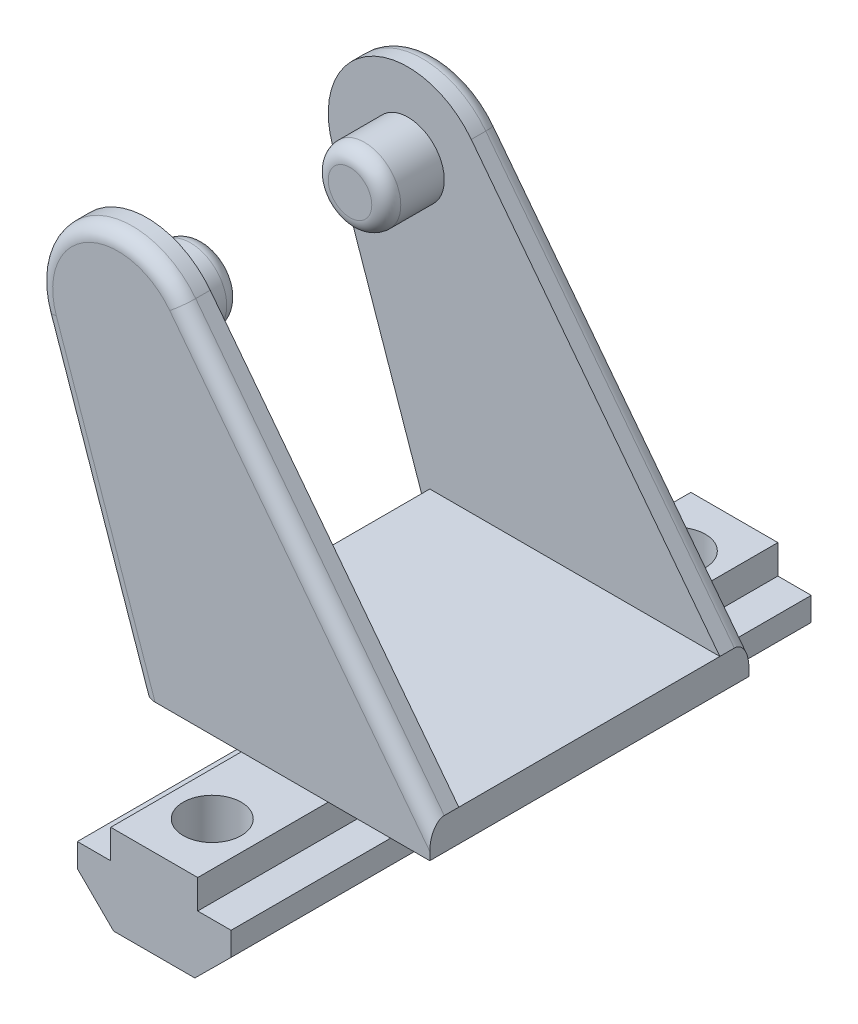
ISO-10303-21;
HEADER;
FILE_DESCRIPTION(('STEP AP214'),'2;1');
FILE_NAME('part.step','',(''),(''),'','','');
FILE_SCHEMA(('AUTOMOTIVE_DESIGN { 1 0 10303 214 1 1 1 1 }'));
ENDSEC;
DATA;
#1=APPLICATION_CONTEXT('core data for automotive mechanical design processes');
#2=APPLICATION_PROTOCOL_DEFINITION('international standard','automotive_design',2000,#1);
#3=PRODUCT_CONTEXT('',#1,'mechanical');
#4=PRODUCT('Part','Part','',(#3));
#5=PRODUCT_RELATED_PRODUCT_CATEGORY('part','',(#4));
#6=PRODUCT_DEFINITION_FORMATION('','',#4);
#7=PRODUCT_DEFINITION_CONTEXT('part definition',#1,'design');
#8=PRODUCT_DEFINITION('design','',#6,#7);
#9=PRODUCT_DEFINITION_SHAPE('','',#8);
#10=(LENGTH_UNIT() NAMED_UNIT(*) SI_UNIT(.MILLI.,.METRE.));
#11=(NAMED_UNIT(*) PLANE_ANGLE_UNIT() SI_UNIT($,.RADIAN.));
#12=(NAMED_UNIT(*) SI_UNIT($,.STERADIAN.) SOLID_ANGLE_UNIT());
#13=UNCERTAINTY_MEASURE_WITH_UNIT(LENGTH_MEASURE(1.E-05),#10,'distance_accuracy_value','');
#14=(GEOMETRIC_REPRESENTATION_CONTEXT(3) GLOBAL_UNCERTAINTY_ASSIGNED_CONTEXT((#13)) GLOBAL_UNIT_ASSIGNED_CONTEXT((#10,
#11,#12)) REPRESENTATION_CONTEXT('',''));
#15=CARTESIAN_POINT('',(0.,0.,0.));
#16=DIRECTION('',(0.,0.,1.));
#17=DIRECTION('',(1.,0.,0.));
#18=AXIS2_PLACEMENT_3D('',#15,#16,#17);
#19=CARTESIAN_POINT('',(-10.,2.2,11.));
#20=DIRECTION('',(1.,0.,0.));
#21=DIRECTION('',(0.,0.,-1.));
#22=AXIS2_PLACEMENT_3D('',#19,#20,#21);
#23=PLANE('',#22);
#24=DIRECTION('',(0.,1.,0.));
#25=VECTOR('',#24,1.);
#26=CARTESIAN_POINT('',(-10.,2.2,-9.));
#27=LINE('',#26,#25);
#28=CARTESIAN_POINT('',(-10.,0.,-9.));
#29=VERTEX_POINT('',#28);
#30=CARTESIAN_POINT('',(-10.,2.2,-9.));
#31=VERTEX_POINT('',#30);
#32=EDGE_CURVE('E253',#29,#31,#27,.T.);
#33=ORIENTED_EDGE('',*,*,#32,.F.);
#34=DIRECTION('',(0.,0.,1.));
#35=VECTOR('',#34,1.);
#36=CARTESIAN_POINT('',(-10.,0.,11.));
#37=LINE('',#36,#35);
#38=CARTESIAN_POINT('',(-10.,0.,9.));
#39=VERTEX_POINT('',#38);
#40=EDGE_CURVE('E290',#29,#39,#37,.T.);
#41=ORIENTED_EDGE('',*,*,#40,.T.);
#42=DIRECTION('',(0.,-1.,0.));
#43=VECTOR('',#42,1.);
#44=CARTESIAN_POINT('',(-10.,2.2,9.));
#45=LINE('',#44,#43);
#46=CARTESIAN_POINT('',(-10.,2.2,9.));
#47=VERTEX_POINT('',#46);
#48=EDGE_CURVE('E286',#47,#39,#45,.T.);
#49=ORIENTED_EDGE('',*,*,#48,.F.);
#50=DIRECTION('',(0.,0.,1.));
#51=VECTOR('',#50,1.);
#52=CARTESIAN_POINT('',(-10.,2.2,11.));
#53=LINE('',#52,#51);
#54=EDGE_CURVE('E291',#31,#47,#53,.T.);
#55=ORIENTED_EDGE('',*,*,#54,.F.);
#56=EDGE_LOOP('',(#33,#41,#49,#55));
#57=FACE_BOUND('',#56,.T.);
#58=ADVANCED_FACE('F39',(#57),#23,.F.);
#59=CARTESIAN_POINT('',(0.,2.2,0.));
#60=DIRECTION('',(0.,-1.,0.));
#61=DIRECTION('',(0.,0.,-1.));
#62=AXIS2_PLACEMENT_3D('',#59,#60,#61);
#63=PLANE('',#62);
#64=DIRECTION('',(1.,0.,0.));
#65=VECTOR('',#64,1.);
#66=CARTESIAN_POINT('',(0.,2.2,-9.));
#67=LINE('',#66,#65);
#68=CARTESIAN_POINT('',(10.,2.2,-9.));
#69=VERTEX_POINT('',#68);
#70=EDGE_CURVE('E248',#31,#69,#67,.T.);
#71=ORIENTED_EDGE('',*,*,#70,.F.);
#72=ORIENTED_EDGE('',*,*,#54,.T.);
#73=DIRECTION('',(-1.,0.,0.));
#74=VECTOR('',#73,1.);
#75=CARTESIAN_POINT('',(0.,2.2,9.));
#76=LINE('',#75,#74);
#77=CARTESIAN_POINT('',(10.,2.2,9.));
#78=VERTEX_POINT('',#77);
#79=EDGE_CURVE('E275',#78,#47,#76,.T.);
#80=ORIENTED_EDGE('',*,*,#79,.F.);
#81=DIRECTION('',(0.,0.,-1.));
#82=VECTOR('',#81,1.);
#83=CARTESIAN_POINT('',(10.,2.2,-11.));
#84=LINE('',#83,#82);
#85=EDGE_CURVE('E294',#78,#69,#84,.T.);
#86=ORIENTED_EDGE('',*,*,#85,.T.);
#87=EDGE_LOOP('',(#71,#72,#80,#86));
#88=FACE_BOUND('',#87,.T.);
#89=ADVANCED_FACE('F611',(#88),#63,.F.);
#90=CARTESIAN_POINT('',(-3.,0.,20.));
#91=DIRECTION('',(0.,-1.,0.));
#92=DIRECTION('',(0.,0.,-1.));
#93=AXIS2_PLACEMENT_3D('',#90,#91,#92);
#94=PLANE('',#93);
#95=CARTESIAN_POINT('',(0.,0.,-16.));
#96=DIRECTION('',(0.,1.,0.));
#97=DIRECTION('',(0.,0.,1.));
#98=AXIS2_PLACEMENT_3D('',#95,#96,#97);
#99=CIRCLE('',#98,2.);
#100=CARTESIAN_POINT('',(0.,0.,-14.));
#101=VERTEX_POINT('',#100);
#102=EDGE_CURVE('E508',#101,#101,#99,.T.);
#103=ORIENTED_EDGE('',*,*,#102,.F.);
#104=EDGE_LOOP('',(#103));
#105=FACE_BOUND('',#104,.T.);
#106=DIRECTION('',(-1.,0.,0.));
#107=VECTOR('',#106,1.);
#108=CARTESIAN_POINT('',(-10.,0.,-11.));
#109=LINE('',#108,#107);
#110=CARTESIAN_POINT('',(3.,0.,-11.));
#111=VERTEX_POINT('',#110);
#112=CARTESIAN_POINT('',(-3.,0.,-11.));
#113=VERTEX_POINT('',#112);
#114=EDGE_CURVE('E315',#111,#113,#109,.T.);
#115=ORIENTED_EDGE('',*,*,#114,.F.);
#116=DIRECTION('',(0.,0.,-1.));
#117=VECTOR('',#116,1.);
#118=CARTESIAN_POINT('',(3.,0.,20.));
#119=LINE('',#118,#117);
#120=CARTESIAN_POINT('',(3.,0.,-20.));
#121=VERTEX_POINT('',#120);
#122=EDGE_CURVE('E390',#111,#121,#119,.T.);
#123=ORIENTED_EDGE('',*,*,#122,.T.);
#124=DIRECTION('',(-1.,0.,0.));
#125=VECTOR('',#124,1.);
#126=CARTESIAN_POINT('',(-3.,0.,-20.));
#127=LINE('',#126,#125);
#128=CARTESIAN_POINT('',(-3.,0.,-20.));
#129=VERTEX_POINT('',#128);
#130=EDGE_CURVE('E327',#121,#129,#127,.T.);
#131=ORIENTED_EDGE('',*,*,#130,.T.);
#132=DIRECTION('',(0.,0.,-1.));
#133=VECTOR('',#132,1.);
#134=CARTESIAN_POINT('',(-3.,0.,20.));
#135=LINE('',#134,#133);
#136=EDGE_CURVE('E354',#113,#129,#135,.T.);
#137=ORIENTED_EDGE('',*,*,#136,.F.);
#138=EDGE_LOOP('',(#115,#123,#131,#137));
#139=FACE_BOUND('',#138,.T.);
#140=ADVANCED_FACE('F530',(#105,#139),#94,.F.);
#141=CARTESIAN_POINT('',(0.,0.,16.));
#142=DIRECTION('',(0.,1.,0.));
#143=DIRECTION('',(0.,0.,1.));
#144=AXIS2_PLACEMENT_3D('',#141,#142,#143);
#145=CIRCLE('',#144,2.);
#146=CARTESIAN_POINT('',(0.,0.,18.));
#147=VERTEX_POINT('',#146);
#148=EDGE_CURVE('E519',#147,#147,#145,.T.);
#149=ORIENTED_EDGE('',*,*,#148,.F.);
#150=EDGE_LOOP('',(#149));
#151=FACE_BOUND('',#150,.T.);
#152=DIRECTION('',(1.,0.,0.));
#153=VECTOR('',#152,1.);
#154=CARTESIAN_POINT('',(10.,0.,11.));
#155=LINE('',#154,#153);
#156=CARTESIAN_POINT('',(-3.,0.,11.));
#157=VERTEX_POINT('',#156);
#158=CARTESIAN_POINT('',(3.,0.,11.));
#159=VERTEX_POINT('',#158);
#160=EDGE_CURVE('E307',#157,#159,#155,.T.);
#161=ORIENTED_EDGE('',*,*,#160,.F.);
#162=CARTESIAN_POINT('',(-3.,0.,20.));
#163=VERTEX_POINT('',#162);
#164=EDGE_CURVE('E386',#163,#157,#135,.T.);
#165=ORIENTED_EDGE('',*,*,#164,.F.);
#166=DIRECTION('',(-1.,0.,0.));
#167=VECTOR('',#166,1.);
#168=CARTESIAN_POINT('',(-3.,0.,20.));
#169=LINE('',#168,#167);
#170=CARTESIAN_POINT('',(3.,0.,20.));
#171=VERTEX_POINT('',#170);
#172=EDGE_CURVE('E351',#171,#163,#169,.T.);
#173=ORIENTED_EDGE('',*,*,#172,.F.);
#174=EDGE_CURVE('E392',#171,#159,#119,.T.);
#175=ORIENTED_EDGE('',*,*,#174,.T.);
#176=EDGE_LOOP('',(#161,#165,#173,#175));
#177=FACE_BOUND('',#176,.T.);
#178=ADVANCED_FACE('F526',(#151,#177),#94,.F.);
#179=CARTESIAN_POINT('',(-3.,0.,20.));
#180=DIRECTION('',(1.,0.,0.));
#181=DIRECTION('',(0.,1.,0.));
#182=AXIS2_PLACEMENT_3D('',#179,#180,#181);
#183=PLANE('',#182);
#184=DIRECTION('',(0.,-1.,0.));
#185=VECTOR('',#184,1.);
#186=CARTESIAN_POINT('',(-3.,0.,-20.));
#187=LINE('',#186,#185);
#188=CARTESIAN_POINT('',(-3.,-2.,-20.));
#189=VERTEX_POINT('',#188);
#190=EDGE_CURVE('E321',#129,#189,#187,.T.);
#191=ORIENTED_EDGE('',*,*,#190,.T.);
#192=DIRECTION('',(0.,0.,-1.));
#193=VECTOR('',#192,1.);
#194=CARTESIAN_POINT('',(-3.,-2.,20.));
#195=LINE('',#194,#193);
#196=CARTESIAN_POINT('',(-3.,-2.,20.));
#197=VERTEX_POINT('',#196);
#198=EDGE_CURVE('E424',#197,#189,#195,.T.);
#199=ORIENTED_EDGE('',*,*,#198,.F.);
#200=DIRECTION('',(0.,-1.,0.));
#201=VECTOR('',#200,1.);
#202=CARTESIAN_POINT('',(-3.,0.,20.));
#203=LINE('',#202,#201);
#204=EDGE_CURVE('E322',#163,#197,#203,.T.);
#205=ORIENTED_EDGE('',*,*,#204,.F.);
#206=ORIENTED_EDGE('',*,*,#164,.T.);
#207=EDGE_CURVE('E391',#157,#113,#135,.T.);
#208=ORIENTED_EDGE('',*,*,#207,.T.);
#209=ORIENTED_EDGE('',*,*,#136,.T.);
#210=EDGE_LOOP('',(#191,#199,#205,#206,#208,#209));
#211=FACE_BOUND('',#210,.T.);
#212=ADVANCED_FACE('F529',(#211),#183,.F.);
#213=CARTESIAN_POINT('',(-3.,-2.,20.));
#214=DIRECTION('',(0.,-1.,0.));
#215=DIRECTION('',(1.,0.,0.));
#216=AXIS2_PLACEMENT_3D('',#213,#214,#215);
#217=PLANE('',#216);
#218=DIRECTION('',(-1.,0.,0.));
#219=VECTOR('',#218,1.);
#220=CARTESIAN_POINT('',(-3.,-2.,-20.));
#221=LINE('',#220,#219);
#222=CARTESIAN_POINT('',(-5.3,-2.,-20.));
#223=VERTEX_POINT('',#222);
#224=EDGE_CURVE('E358',#189,#223,#221,.T.);
#225=ORIENTED_EDGE('',*,*,#224,.T.);
#226=DIRECTION('',(0.,0.,-1.));
#227=VECTOR('',#226,1.);
#228=CARTESIAN_POINT('',(-5.3,-2.,20.));
#229=LINE('',#228,#227);
#230=CARTESIAN_POINT('',(-5.3,-2.,20.));
#231=VERTEX_POINT('',#230);
#232=EDGE_CURVE('E420',#231,#223,#229,.T.);
#233=ORIENTED_EDGE('',*,*,#232,.F.);
#234=DIRECTION('',(-1.,0.,0.));
#235=VECTOR('',#234,1.);
#236=CARTESIAN_POINT('',(-3.,-2.,20.));
#237=LINE('',#236,#235);
#238=EDGE_CURVE('E326',#197,#231,#237,.T.);
#239=ORIENTED_EDGE('',*,*,#238,.F.);
#240=ORIENTED_EDGE('',*,*,#198,.T.);
#241=EDGE_LOOP('',(#225,#233,#239,#240));
#242=FACE_BOUND('',#241,.T.);
#243=ADVANCED_FACE('F567',(#242),#217,.F.);
#244=CARTESIAN_POINT('',(-5.3,-2.,20.));
#245=DIRECTION('',(1.,0.,0.));
#246=DIRECTION('',(0.,0.,-1.));
#247=AXIS2_PLACEMENT_3D('',#244,#245,#246);
#248=PLANE('',#247);
#249=DIRECTION('',(0.,-1.,0.));
#250=VECTOR('',#249,1.);
#251=CARTESIAN_POINT('',(-5.3,-2.,-20.));
#252=LINE('',#251,#250);
#253=CARTESIAN_POINT('',(-5.3,-3.62,-20.));
#254=VERTEX_POINT('',#253);
#255=EDGE_CURVE('E361',#223,#254,#252,.T.);
#256=ORIENTED_EDGE('',*,*,#255,.T.);
#257=DIRECTION('',(0.,0.,-1.));
#258=VECTOR('',#257,1.);
#259=CARTESIAN_POINT('',(-5.3,-3.62,20.));
#260=LINE('',#259,#258);
#261=CARTESIAN_POINT('',(-5.3,-3.62,20.));
#262=VERTEX_POINT('',#261);
#263=EDGE_CURVE('E416',#262,#254,#260,.T.);
#264=ORIENTED_EDGE('',*,*,#263,.F.);
#265=DIRECTION('',(0.,-1.,0.));
#266=VECTOR('',#265,1.);
#267=CARTESIAN_POINT('',(-5.3,-2.,20.));
#268=LINE('',#267,#266);
#269=EDGE_CURVE('E330',#231,#262,#268,.T.);
#270=ORIENTED_EDGE('',*,*,#269,.F.);
#271=ORIENTED_EDGE('',*,*,#232,.T.);
#272=EDGE_LOOP('',(#256,#264,#270,#271));
#273=FACE_BOUND('',#272,.T.);
#274=ADVANCED_FACE('F680',(#273),#248,.F.);
#275=CARTESIAN_POINT('',(-2.8,-6.1,20.));
#276=DIRECTION('',(0.704261315504488,0.709940842242428,0.));
#277=DIRECTION('',(-0.709940842242428,0.704261315504488,0.));
#278=AXIS2_PLACEMENT_3D('',#275,#276,#277);
#279=PLANE('',#278);
#280=DIRECTION('',(0.709940842242428,-0.704261315504488,0.));
#281=VECTOR('',#280,1.);
#282=CARTESIAN_POINT('',(-2.8,-6.1,-20.));
#283=LINE('',#282,#281);
#284=CARTESIAN_POINT('',(-2.8,-6.1,-20.));
#285=VERTEX_POINT('',#284);
#286=EDGE_CURVE('E364',#254,#285,#283,.T.);
#287=ORIENTED_EDGE('',*,*,#286,.T.);
#288=DIRECTION('',(0.,0.,-1.));
#289=VECTOR('',#288,1.);
#290=CARTESIAN_POINT('',(-2.8,-6.1,20.));
#291=LINE('',#290,#289);
#292=CARTESIAN_POINT('',(-2.8,-6.1,20.));
#293=VERTEX_POINT('',#292);
#294=EDGE_CURVE('E412',#293,#285,#291,.T.);
#295=ORIENTED_EDGE('',*,*,#294,.F.);
#296=DIRECTION('',(0.709940842242428,-0.704261315504488,0.));
#297=VECTOR('',#296,1.);
#298=CARTESIAN_POINT('',(-2.8,-6.1,20.));
#299=LINE('',#298,#297);
#300=EDGE_CURVE('E333',#262,#293,#299,.T.);
#301=ORIENTED_EDGE('',*,*,#300,.F.);
#302=ORIENTED_EDGE('',*,*,#263,.T.);
#303=EDGE_LOOP('',(#287,#295,#301,#302));
#304=FACE_BOUND('',#303,.T.);
#305=ADVANCED_FACE('F677',(#304),#279,.F.);
#306=CARTESIAN_POINT('',(-2.8,-6.1,20.));
#307=DIRECTION('',(0.,1.,0.));
#308=DIRECTION('',(0.,0.,1.));
#309=AXIS2_PLACEMENT_3D('',#306,#307,#308);
#310=PLANE('',#309);
#311=CARTESIAN_POINT('',(0.,-6.1,-16.));
#312=DIRECTION('',(0.,1.,0.));
#313=DIRECTION('',(0.,0.,1.));
#314=AXIS2_PLACEMENT_3D('',#311,#312,#313);
#315=CIRCLE('',#314,2.);
#316=CARTESIAN_POINT('',(0.,-6.1,-14.));
#317=VERTEX_POINT('',#316);
#318=EDGE_CURVE('E499',#317,#317,#315,.T.);
#319=ORIENTED_EDGE('',*,*,#318,.T.);
#320=EDGE_LOOP('',(#319));
#321=FACE_BOUND('',#320,.T.);
#322=CARTESIAN_POINT('',(0.,-6.1,16.));
#323=DIRECTION('',(0.,1.,0.));
#324=DIRECTION('',(0.,0.,1.));
#325=AXIS2_PLACEMENT_3D('',#322,#323,#324);
#326=CIRCLE('',#325,2.);
#327=CARTESIAN_POINT('',(0.,-6.1,18.));
#328=VERTEX_POINT('',#327);
#329=EDGE_CURVE('E514',#328,#328,#326,.T.);
#330=ORIENTED_EDGE('',*,*,#329,.T.);
#331=EDGE_LOOP('',(#330));
#332=FACE_BOUND('',#331,.T.);
#333=DIRECTION('',(1.,0.,0.));
#334=VECTOR('',#333,1.);
#335=CARTESIAN_POINT('',(-2.8,-6.1,-20.));
#336=LINE('',#335,#334);
#337=CARTESIAN_POINT('',(2.8,-6.1,-20.));
#338=VERTEX_POINT('',#337);
#339=EDGE_CURVE('E367',#285,#338,#336,.T.);
#340=ORIENTED_EDGE('',*,*,#339,.T.);
#341=DIRECTION('',(0.,0.,-1.));
#342=VECTOR('',#341,1.);
#343=CARTESIAN_POINT('',(2.8,-6.1,20.));
#344=LINE('',#343,#342);
#345=CARTESIAN_POINT('',(2.8,-6.1,20.));
#346=VERTEX_POINT('',#345);
#347=EDGE_CURVE('E408',#346,#338,#344,.T.);
#348=ORIENTED_EDGE('',*,*,#347,.F.);
#349=DIRECTION('',(1.,0.,0.));
#350=VECTOR('',#349,1.);
#351=CARTESIAN_POINT('',(-2.8,-6.1,20.));
#352=LINE('',#351,#350);
#353=EDGE_CURVE('E336',#293,#346,#352,.T.);
#354=ORIENTED_EDGE('',*,*,#353,.F.);
#355=ORIENTED_EDGE('',*,*,#294,.T.);
#356=EDGE_LOOP('',(#340,#348,#354,#355));
#357=FACE_BOUND('',#356,.T.);
#358=ADVANCED_FACE('F673',(#321,#332,#357),#310,.F.);
#359=CARTESIAN_POINT('',(2.8,-6.1,20.));
#360=DIRECTION('',(-0.704261315504488,0.709940842242428,0.));
#361=DIRECTION('',(-0.709940842242428,-0.704261315504488,0.));
#362=AXIS2_PLACEMENT_3D('',#359,#360,#361);
#363=PLANE('',#362);
#364=DIRECTION('',(0.709940842242428,0.704261315504488,0.));
#365=VECTOR('',#364,1.);
#366=CARTESIAN_POINT('',(2.8,-6.1,-20.));
#367=LINE('',#366,#365);
#368=CARTESIAN_POINT('',(5.3,-3.62,-20.));
#369=VERTEX_POINT('',#368);
#370=EDGE_CURVE('E370',#338,#369,#367,.T.);
#371=ORIENTED_EDGE('',*,*,#370,.T.);
#372=DIRECTION('',(0.,0.,-1.));
#373=VECTOR('',#372,1.);
#374=CARTESIAN_POINT('',(5.3,-3.62,20.));
#375=LINE('',#374,#373);
#376=CARTESIAN_POINT('',(5.3,-3.62,20.));
#377=VERTEX_POINT('',#376);
#378=EDGE_CURVE('E404',#377,#369,#375,.T.);
#379=ORIENTED_EDGE('',*,*,#378,.F.);
#380=DIRECTION('',(0.709940842242428,0.704261315504488,0.));
#381=VECTOR('',#380,1.);
#382=CARTESIAN_POINT('',(2.8,-6.1,20.));
#383=LINE('',#382,#381);
#384=EDGE_CURVE('E339',#346,#377,#383,.T.);
#385=ORIENTED_EDGE('',*,*,#384,.F.);
#386=ORIENTED_EDGE('',*,*,#347,.T.);
#387=EDGE_LOOP('',(#371,#379,#385,#386));
#388=FACE_BOUND('',#387,.T.);
#389=ADVANCED_FACE('F669',(#388),#363,.F.);
#390=CARTESIAN_POINT('',(5.3,-2.,20.));
#391=DIRECTION('',(-1.,0.,0.));
#392=DIRECTION('',(0.,0.,1.));
#393=AXIS2_PLACEMENT_3D('',#390,#391,#392);
#394=PLANE('',#393);
#395=DIRECTION('',(0.,1.,0.));
#396=VECTOR('',#395,1.);
#397=CARTESIAN_POINT('',(5.3,-2.,-20.));
#398=LINE('',#397,#396);
#399=CARTESIAN_POINT('',(5.3,-2.,-20.));
#400=VERTEX_POINT('',#399);
#401=EDGE_CURVE('E373',#369,#400,#398,.T.);
#402=ORIENTED_EDGE('',*,*,#401,.T.);
#403=DIRECTION('',(0.,0.,-1.));
#404=VECTOR('',#403,1.);
#405=CARTESIAN_POINT('',(5.3,-2.,20.));
#406=LINE('',#405,#404);
#407=CARTESIAN_POINT('',(5.3,-2.,20.));
#408=VERTEX_POINT('',#407);
#409=EDGE_CURVE('E400',#408,#400,#406,.T.);
#410=ORIENTED_EDGE('',*,*,#409,.F.);
#411=DIRECTION('',(0.,1.,0.));
#412=VECTOR('',#411,1.);
#413=CARTESIAN_POINT('',(5.3,-2.,20.));
#414=LINE('',#413,#412);
#415=EDGE_CURVE('E342',#377,#408,#414,.T.);
#416=ORIENTED_EDGE('',*,*,#415,.F.);
#417=ORIENTED_EDGE('',*,*,#378,.T.);
#418=EDGE_LOOP('',(#402,#410,#416,#417));
#419=FACE_BOUND('',#418,.T.);
#420=ADVANCED_FACE('F665',(#419),#394,.F.);
#421=CARTESIAN_POINT('',(3.,-2.,20.));
#422=DIRECTION('',(0.,-1.,0.));
#423=DIRECTION('',(1.,0.,0.));
#424=AXIS2_PLACEMENT_3D('',#421,#422,#423);
#425=PLANE('',#424);
#426=DIRECTION('',(-1.,0.,0.));
#427=VECTOR('',#426,1.);
#428=CARTESIAN_POINT('',(3.,-2.,-20.));
#429=LINE('',#428,#427);
#430=CARTESIAN_POINT('',(3.,-2.,-20.));
#431=VERTEX_POINT('',#430);
#432=EDGE_CURVE('E376',#400,#431,#429,.T.);
#433=ORIENTED_EDGE('',*,*,#432,.T.);
#434=DIRECTION('',(0.,0.,-1.));
#435=VECTOR('',#434,1.);
#436=CARTESIAN_POINT('',(3.,-2.,20.));
#437=LINE('',#436,#435);
#438=CARTESIAN_POINT('',(3.,-2.,20.));
#439=VERTEX_POINT('',#438);
#440=EDGE_CURVE('E395',#439,#431,#437,.T.);
#441=ORIENTED_EDGE('',*,*,#440,.F.);
#442=DIRECTION('',(-1.,0.,0.));
#443=VECTOR('',#442,1.);
#444=CARTESIAN_POINT('',(3.,-2.,20.));
#445=LINE('',#444,#443);
#446=EDGE_CURVE('E345',#408,#439,#445,.T.);
#447=ORIENTED_EDGE('',*,*,#446,.F.);
#448=ORIENTED_EDGE('',*,*,#409,.T.);
#449=EDGE_LOOP('',(#433,#441,#447,#448));
#450=FACE_BOUND('',#449,.T.);
#451=ADVANCED_FACE('F662',(#450),#425,.F.);
#452=CARTESIAN_POINT('',(3.,0.,20.));
#453=DIRECTION('',(-1.,0.,0.));
#454=DIRECTION('',(0.,-1.,0.));
#455=AXIS2_PLACEMENT_3D('',#452,#453,#454);
#456=PLANE('',#455);
#457=DIRECTION('',(0.,1.,0.));
#458=VECTOR('',#457,1.);
#459=CARTESIAN_POINT('',(3.,0.,-20.));
#460=LINE('',#459,#458);
#461=EDGE_CURVE('E379',#431,#121,#460,.T.);
#462=ORIENTED_EDGE('',*,*,#461,.T.);
#463=ORIENTED_EDGE('',*,*,#122,.F.);
#464=EDGE_CURVE('E396',#159,#111,#119,.T.);
#465=ORIENTED_EDGE('',*,*,#464,.F.);
#466=ORIENTED_EDGE('',*,*,#174,.F.);
#467=DIRECTION('',(0.,1.,0.));
#468=VECTOR('',#467,1.);
#469=CARTESIAN_POINT('',(3.,0.,20.));
#470=LINE('',#469,#468);
#471=EDGE_CURVE('E348',#439,#171,#470,.T.);
#472=ORIENTED_EDGE('',*,*,#471,.F.);
#473=ORIENTED_EDGE('',*,*,#440,.T.);
#474=EDGE_LOOP('',(#462,#463,#465,#466,#472,#473));
#475=FACE_BOUND('',#474,.T.);
#476=ADVANCED_FACE('F575',(#475),#456,.F.);
#477=CARTESIAN_POINT('',(0.,0.,20.));
#478=DIRECTION('',(0.,0.,-1.));
#479=DIRECTION('',(-1.,0.,0.));
#480=AXIS2_PLACEMENT_3D('',#477,#478,#479);
#481=PLANE('',#480);
#482=ORIENTED_EDGE('',*,*,#204,.T.);
#483=ORIENTED_EDGE('',*,*,#238,.T.);
#484=ORIENTED_EDGE('',*,*,#269,.T.);
#485=ORIENTED_EDGE('',*,*,#300,.T.);
#486=ORIENTED_EDGE('',*,*,#353,.T.);
#487=ORIENTED_EDGE('',*,*,#384,.T.);
#488=ORIENTED_EDGE('',*,*,#415,.T.);
#489=ORIENTED_EDGE('',*,*,#446,.T.);
#490=ORIENTED_EDGE('',*,*,#471,.T.);
#491=ORIENTED_EDGE('',*,*,#172,.T.);
#492=EDGE_LOOP('',(#482,#483,#484,#485,#486,#487,#488,#489,#490,#491));
#493=FACE_BOUND('',#492,.T.);
#494=ADVANCED_FACE('F570',(#493),#481,.F.);
#495=CARTESIAN_POINT('',(0.,0.,-20.));
#496=DIRECTION('',(0.,0.,-1.));
#497=DIRECTION('',(-1.,0.,0.));
#498=AXIS2_PLACEMENT_3D('',#495,#496,#497);
#499=PLANE('',#498);
#500=ORIENTED_EDGE('',*,*,#190,.F.);
#501=ORIENTED_EDGE('',*,*,#130,.F.);
#502=ORIENTED_EDGE('',*,*,#461,.F.);
#503=ORIENTED_EDGE('',*,*,#432,.F.);
#504=ORIENTED_EDGE('',*,*,#401,.F.);
#505=ORIENTED_EDGE('',*,*,#370,.F.);
#506=ORIENTED_EDGE('',*,*,#339,.F.);
#507=ORIENTED_EDGE('',*,*,#286,.F.);
#508=ORIENTED_EDGE('',*,*,#255,.F.);
#509=ORIENTED_EDGE('',*,*,#224,.F.);
#510=EDGE_LOOP('',(#500,#501,#502,#503,#504,#505,#506,#507,#508,#509));
#511=FACE_BOUND('',#510,.T.);
#512=ADVANCED_FACE('F562',(#511),#499,.T.);
#513=CARTESIAN_POINT('',(0.,0.,0.));
#514=DIRECTION('',(0.,-1.,0.));
#515=DIRECTION('',(0.,0.,-1.));
#516=AXIS2_PLACEMENT_3D('',#513,#514,#515);
#517=PLANE('',#516);
#518=CARTESIAN_POINT('',(-10.,0.,-10.));
#519=VERTEX_POINT('',#518);
#520=EDGE_CURVE('E232',#519,#29,#37,.T.);
#521=ORIENTED_EDGE('',*,*,#520,.F.);
#522=CARTESIAN_POINT('',(-8.94179961169701,0.,-10.));
#523=DIRECTION('',(0.,-1.,0.));
#524=DIRECTION('',(1.,0.,0.));
#525=AXIS2_PLACEMENT_3D('',#522,#523,#524);
#526=ELLIPSE('',#525,1.05820038830299,1.);
#527=CARTESIAN_POINT('',(-8.94179961169701,0.,-11.));
#528=VERTEX_POINT('',#527);
#529=EDGE_CURVE('E11',#519,#528,#526,.T.);
#530=ORIENTED_EDGE('',*,*,#529,.T.);
#531=EDGE_CURVE('E311',#113,#528,#109,.T.);
#532=ORIENTED_EDGE('',*,*,#531,.F.);
#533=ORIENTED_EDGE('',*,*,#207,.F.);
#534=CARTESIAN_POINT('',(-8.94179961169701,0.,11.));
#535=VERTEX_POINT('',#534);
#536=EDGE_CURVE('E303',#535,#157,#155,.T.);
#537=ORIENTED_EDGE('',*,*,#536,.F.);
#538=CARTESIAN_POINT('',(-8.94179961169701,0.,10.));
#539=DIRECTION('',(0.,-1.,0.));
#540=DIRECTION('',(-1.,0.,0.));
#541=AXIS2_PLACEMENT_3D('',#538,#539,#540);
#542=ELLIPSE('',#541,1.05820038830299,1.);
#543=CARTESIAN_POINT('',(-10.,0.,10.));
#544=VERTEX_POINT('',#543);
#545=EDGE_CURVE('E459',#535,#544,#542,.T.);
#546=ORIENTED_EDGE('',*,*,#545,.T.);
#547=DIRECTION('',(0.,0.,1.));
#548=VECTOR('',#547,1.);
#549=CARTESIAN_POINT('',(-10.,0.,9.));
#550=LINE('',#549,#548);
#551=EDGE_CURVE('E271',#39,#544,#550,.T.);
#552=ORIENTED_EDGE('',*,*,#551,.F.);
#553=ORIENTED_EDGE('',*,*,#40,.F.);
#554=EDGE_LOOP('',(#521,#530,#532,#533,#537,#546,#552,#553));
#555=FACE_BOUND('',#554,.T.);
#556=ADVANCED_FACE('F549',(#555),#517,.T.);
#557=CARTESIAN_POINT('',(10.,2.2,11.));
#558=DIRECTION('',(0.,0.,-1.));
#559=DIRECTION('',(-1.,0.,0.));
#560=AXIS2_PLACEMENT_3D('',#557,#558,#559);
#561=PLANE('',#560);
#562=DIRECTION('',(0.,-1.,0.));
#563=VECTOR('',#562,1.);
#564=CARTESIAN_POINT('',(10.,2.2,11.));
#565=LINE('',#564,#563);
#566=CARTESIAN_POINT('',(10.,0.558921979991003,11.));
#567=VERTEX_POINT('',#566);
#568=CARTESIAN_POINT('',(10.,0.,11.));
#569=VERTEX_POINT('',#568);
#570=EDGE_CURVE('E318',#567,#569,#565,.T.);
#571=ORIENTED_EDGE('',*,*,#570,.F.);
#572=DIRECTION('',(-0.60935555031961,0.792897101328215,0.));
#573=VECTOR('',#572,1.);
#574=CARTESIAN_POINT('',(-7.93196304402304,23.8920999764382,11.));
#575=LINE('',#574,#573);
#576=CARTESIAN_POINT('',(-7.93196304402303,23.8920999764382,11.));
#577=VERTEX_POINT('',#576);
#578=EDGE_CURVE('E446',#567,#577,#575,.T.);
#579=ORIENTED_EDGE('',*,*,#578,.T.);
#580=CARTESIAN_POINT('',(-11.5,21.15,11.));
#581=DIRECTION('',(0.,0.,-1.));
#582=DIRECTION('',(-1.,0.,0.));
#583=AXIS2_PLACEMENT_3D('',#580,#581,#582);
#584=CIRCLE('',#583,4.5);
#585=CARTESIAN_POINT('',(-15.7525026920624,19.6781912984353,11.));
#586=VERTEX_POINT('',#585);
#587=EDGE_CURVE('E443',#577,#586,#584,.F.);
#588=ORIENTED_EDGE('',*,*,#587,.T.);
#589=DIRECTION('',(0.327068600347714,-0.9450005982361,0.));
#590=VECTOR('',#589,1.);
#591=CARTESIAN_POINT('',(-9.0549994017639,0.327068600347715,11.));
#592=LINE('',#591,#590);
#593=EDGE_CURVE('E440',#586,#535,#592,.T.);
#594=ORIENTED_EDGE('',*,*,#593,.T.);
#595=ORIENTED_EDGE('',*,*,#536,.T.);
#596=ORIENTED_EDGE('',*,*,#160,.T.);
#597=EDGE_CURVE('E302',#159,#569,#155,.T.);
#598=ORIENTED_EDGE('',*,*,#597,.T.);
#599=EDGE_LOOP('',(#571,#579,#588,#594,#595,#596,#598));
#600=FACE_BOUND('',#599,.T.);
#601=ADVANCED_FACE('F622',(#600),#561,.F.);
#602=CARTESIAN_POINT('',(10.,2.2,-11.));
#603=DIRECTION('',(-1.,0.,0.));
#604=DIRECTION('',(0.,0.,1.));
#605=AXIS2_PLACEMENT_3D('',#602,#603,#604);
#606=PLANE('',#605);
#607=DIRECTION('',(0.,-1.,0.));
#608=VECTOR('',#607,1.);
#609=CARTESIAN_POINT('',(10.,2.2,-11.));
#610=LINE('',#609,#608);
#611=CARTESIAN_POINT('',(10.,0.558921979991002,-11.));
#612=VERTEX_POINT('',#611);
#613=CARTESIAN_POINT('',(10.,0.,-11.));
#614=VERTEX_POINT('',#613);
#615=EDGE_CURVE('E299',#612,#614,#610,.T.);
#616=ORIENTED_EDGE('',*,*,#615,.F.);
#617=CARTESIAN_POINT('',(10.,0.558921979991002,-10.));
#618=DIRECTION('',(-1.,0.,0.));
#619=DIRECTION('',(0.,1.,0.));
#620=AXIS2_PLACEMENT_3D('',#617,#618,#619);
#621=ELLIPSE('',#620,1.641078020009,1.);
#622=CARTESIAN_POINT('',(10.,2.2,-10.));
#623=VERTEX_POINT('',#622);
#624=EDGE_CURVE('E491',#612,#623,#621,.F.);
#625=ORIENTED_EDGE('',*,*,#624,.T.);
#626=DIRECTION('',(0.,0.,-1.));
#627=VECTOR('',#626,1.);
#628=CARTESIAN_POINT('',(10.,2.2,-9.));
#629=LINE('',#628,#627);
#630=EDGE_CURVE('E244',#69,#623,#629,.T.);
#631=ORIENTED_EDGE('',*,*,#630,.F.);
#632=ORIENTED_EDGE('',*,*,#85,.F.);
#633=CARTESIAN_POINT('',(10.,2.2,10.));
#634=VERTEX_POINT('',#633);
#635=EDGE_CURVE('E296',#634,#78,#84,.T.);
#636=ORIENTED_EDGE('',*,*,#635,.F.);
#637=CARTESIAN_POINT('',(10.,0.558921979991002,10.));
#638=DIRECTION('',(-1.,0.,0.));
#639=DIRECTION('',(0.,-1.,0.));
#640=AXIS2_PLACEMENT_3D('',#637,#638,#639);
#641=ELLIPSE('',#640,1.641078020009,1.);
#642=EDGE_CURVE('E453',#634,#567,#641,.F.);
#643=ORIENTED_EDGE('',*,*,#642,.T.);
#644=ORIENTED_EDGE('',*,*,#570,.T.);
#645=DIRECTION('',(0.,0.,-1.));
#646=VECTOR('',#645,1.);
#647=CARTESIAN_POINT('',(10.,0.,-11.));
#648=LINE('',#647,#646);
#649=EDGE_CURVE('E306',#569,#614,#648,.T.);
#650=ORIENTED_EDGE('',*,*,#649,.T.);
#651=EDGE_LOOP('',(#616,#625,#631,#632,#636,#643,#644,#650));
#652=FACE_BOUND('',#651,.T.);
#653=ADVANCED_FACE('F613',(#652),#606,.F.);
#654=CARTESIAN_POINT('',(-10.,2.2,-11.));
#655=DIRECTION('',(0.,0.,1.));
#656=DIRECTION('',(1.,0.,0.));
#657=AXIS2_PLACEMENT_3D('',#654,#655,#656);
#658=PLANE('',#657);
#659=CARTESIAN_POINT('',(-11.5,21.15,-11.));
#660=DIRECTION('',(0.,0.,1.));
#661=DIRECTION('',(1.,0.,0.));
#662=AXIS2_PLACEMENT_3D('',#659,#660,#661);
#663=CIRCLE('',#662,4.5);
#664=CARTESIAN_POINT('',(-15.7525026920624,19.6781912984353,-11.));
#665=VERTEX_POINT('',#664);
#666=CARTESIAN_POINT('',(-7.93196304402303,23.8920999764382,-11.));
#667=VERTEX_POINT('',#666);
#668=EDGE_CURVE('E485',#665,#667,#663,.F.);
#669=ORIENTED_EDGE('',*,*,#668,.T.);
#670=DIRECTION('',(-0.60935555031961,0.792897101328215,0.));
#671=VECTOR('',#670,1.);
#672=CARTESIAN_POINT('',(1.78081916456548,11.253769440214,-11.));
#673=LINE('',#672,#671);
#674=EDGE_CURVE('E488',#667,#612,#673,.F.);
#675=ORIENTED_EDGE('',*,*,#674,.T.);
#676=ORIENTED_EDGE('',*,*,#615,.T.);
#677=EDGE_CURVE('E295',#614,#111,#109,.T.);
#678=ORIENTED_EDGE('',*,*,#677,.T.);
#679=ORIENTED_EDGE('',*,*,#114,.T.);
#680=ORIENTED_EDGE('',*,*,#531,.T.);
#681=DIRECTION('',(0.327068600347714,-0.9450005982361,0.));
#682=VECTOR('',#681,1.);
#683=CARTESIAN_POINT('',(-9.73497545234813,2.29172608781421,-11.));
#684=LINE('',#683,#682);
#685=EDGE_CURVE('E482',#528,#665,#684,.F.);
#686=ORIENTED_EDGE('',*,*,#685,.T.);
#687=EDGE_LOOP('',(#669,#675,#676,#678,#679,#680,#686));
#688=FACE_BOUND('',#687,.T.);
#689=ADVANCED_FACE('F619',(#688),#658,.F.);
#690=ORIENTED_EDGE('',*,*,#677,.F.);
#691=ORIENTED_EDGE('',*,*,#649,.F.);
#692=ORIENTED_EDGE('',*,*,#597,.F.);
#693=ORIENTED_EDGE('',*,*,#464,.T.);
#694=EDGE_LOOP('',(#690,#691,#692,#693));
#695=FACE_BOUND('',#694,.T.);
#696=ADVANCED_FACE('F581',(#695),#517,.T.);
#697=CARTESIAN_POINT('',(-11.5,21.15,9.));
#698=DIRECTION('',(0.,0.,1.));
#699=DIRECTION('',(1.,0.,0.));
#700=AXIS2_PLACEMENT_3D('',#697,#698,#699);
#701=PLANE('',#700);
#702=CARTESIAN_POINT('',(-11.5,21.15,9.));
#703=DIRECTION('',(0.,0.,1.));
#704=DIRECTION('',(1.,0.,0.));
#705=AXIS2_PLACEMENT_3D('',#702,#703,#704);
#706=CIRCLE('',#705,2.5);
#707=CARTESIAN_POINT('',(-9.,21.15,9.));
#708=VERTEX_POINT('',#707);
#709=EDGE_CURVE('E428',#708,#708,#706,.F.);
#710=ORIENTED_EDGE('',*,*,#709,.F.);
#711=EDGE_LOOP('',(#710));
#712=FACE_BOUND('',#711,.T.);
#713=ORIENTED_EDGE('',*,*,#79,.T.);
#714=ORIENTED_EDGE('',*,*,#48,.T.);
#715=DIRECTION('',(0.327068600347714,-0.9450005982361,0.));
#716=VECTOR('',#715,1.);
#717=CARTESIAN_POINT('',(-10.,0.,9.));
#718=LINE('',#717,#716);
#719=CARTESIAN_POINT('',(-16.6975032902986,19.3511226980876,9.));
#720=VERTEX_POINT('',#719);
#721=EDGE_CURVE('E266',#720,#39,#718,.T.);
#722=ORIENTED_EDGE('',*,*,#721,.F.);
#723=CARTESIAN_POINT('',(-11.5,21.15,9.));
#724=DIRECTION('',(0.,0.,1.));
#725=DIRECTION('',(1.,0.,0.));
#726=AXIS2_PLACEMENT_3D('',#723,#724,#725);
#727=CIRCLE('',#726,5.5);
#728=CARTESIAN_POINT('',(-7.13906594269482,24.5014555267579,9.));
#729=VERTEX_POINT('',#728);
#730=EDGE_CURVE('E261',#729,#720,#727,.T.);
#731=ORIENTED_EDGE('',*,*,#730,.F.);
#732=DIRECTION('',(-0.60935555031961,0.792897101328215,0.));
#733=VECTOR('',#732,1.);
#734=CARTESIAN_POINT('',(10.,2.2,9.));
#735=LINE('',#734,#733);
#736=EDGE_CURVE('E257',#78,#729,#735,.T.);
#737=ORIENTED_EDGE('',*,*,#736,.F.);
#738=EDGE_LOOP('',(#713,#714,#722,#731,#737));
#739=FACE_BOUND('',#738,.T.);
#740=ADVANCED_FACE('F594',(#712,#739),#701,.F.);
#741=CARTESIAN_POINT('',(-10.,0.,9.));
#742=DIRECTION('',(-0.9450005982361,-0.327068600347714,0.));
#743=DIRECTION('',(0.327068600347714,-0.9450005982361,0.));
#744=AXIS2_PLACEMENT_3D('',#741,#742,#743);
#745=PLANE('',#744);
#746=ORIENTED_EDGE('',*,*,#551,.T.);
#747=DIRECTION('',(0.327068600347714,-0.9450005982361,0.));
#748=VECTOR('',#747,1.);
#749=CARTESIAN_POINT('',(-16.6975032902986,19.3511226980876,10.));
#750=LINE('',#749,#748);
#751=CARTESIAN_POINT('',(-16.6975032902986,19.3511226980876,10.));
#752=VERTEX_POINT('',#751);
#753=EDGE_CURVE('E462',#544,#752,#750,.F.);
#754=ORIENTED_EDGE('',*,*,#753,.T.);
#755=DIRECTION('',(0.,0.,1.));
#756=VECTOR('',#755,1.);
#757=CARTESIAN_POINT('',(-16.6975032902986,19.3511226980876,9.));
#758=LINE('',#757,#756);
#759=EDGE_CURVE('E276',#720,#752,#758,.T.);
#760=ORIENTED_EDGE('',*,*,#759,.F.);
#761=ORIENTED_EDGE('',*,*,#721,.T.);
#762=EDGE_LOOP('',(#746,#754,#760,#761));
#763=FACE_BOUND('',#762,.T.);
#764=ADVANCED_FACE('F598',(#763),#745,.T.);
#765=CARTESIAN_POINT('',(-11.5,21.15,9.));
#766=DIRECTION('',(0.,0.,1.));
#767=DIRECTION('',(1.,0.,0.));
#768=AXIS2_PLACEMENT_3D('',#765,#766,#767);
#769=CYLINDRICAL_SURFACE('',#768,5.5);
#770=ORIENTED_EDGE('',*,*,#759,.T.);
#771=CARTESIAN_POINT('',(-11.5,21.15,10.));
#772=DIRECTION('',(0.,0.,-1.));
#773=DIRECTION('',(-1.,0.,0.));
#774=AXIS2_PLACEMENT_3D('',#771,#772,#773);
#775=CIRCLE('',#774,5.5);
#776=CARTESIAN_POINT('',(-7.13906594269482,24.5014555267579,10.));
#777=VERTEX_POINT('',#776);
#778=EDGE_CURVE('E456',#752,#777,#775,.T.);
#779=ORIENTED_EDGE('',*,*,#778,.T.);
#780=DIRECTION('',(0.,0.,1.));
#781=VECTOR('',#780,1.);
#782=CARTESIAN_POINT('',(-7.13906594269482,24.5014555267579,9.));
#783=LINE('',#782,#781);
#784=EDGE_CURVE('E270',#729,#777,#783,.T.);
#785=ORIENTED_EDGE('',*,*,#784,.F.);
#786=ORIENTED_EDGE('',*,*,#730,.T.);
#787=EDGE_LOOP('',(#770,#779,#785,#786));
#788=FACE_BOUND('',#787,.T.);
#789=ADVANCED_FACE('F601',(#788),#769,.T.);
#790=CARTESIAN_POINT('',(10.,2.2,9.));
#791=DIRECTION('',(0.792897101328215,0.60935555031961,0.));
#792=DIRECTION('',(-0.60935555031961,0.792897101328215,0.));
#793=AXIS2_PLACEMENT_3D('',#790,#791,#792);
#794=PLANE('',#793);
#795=ORIENTED_EDGE('',*,*,#784,.T.);
#796=DIRECTION('',(-0.60935555031961,0.792897101328215,0.));
#797=VECTOR('',#796,1.);
#798=CARTESIAN_POINT('',(10.,2.2,10.));
#799=LINE('',#798,#797);
#800=EDGE_CURVE('E450',#777,#634,#799,.F.);
#801=ORIENTED_EDGE('',*,*,#800,.T.);
#802=ORIENTED_EDGE('',*,*,#635,.T.);
#803=ORIENTED_EDGE('',*,*,#736,.T.);
#804=EDGE_LOOP('',(#795,#801,#802,#803));
#805=FACE_BOUND('',#804,.T.);
#806=ADVANCED_FACE('F603',(#805),#794,.T.);
#807=CARTESIAN_POINT('',(-11.5,21.15,5.));
#808=DIRECTION('',(0.,0.,1.));
#809=DIRECTION('',(1.,0.,0.));
#810=AXIS2_PLACEMENT_3D('',#807,#808,#809);
#811=CYLINDRICAL_SURFACE('',#810,2.5);
#812=CARTESIAN_POINT('',(-11.5,21.15,6.));
#813=DIRECTION('',(0.,0.,-1.));
#814=DIRECTION('',(-1.,0.,0.));
#815=AXIS2_PLACEMENT_3D('',#812,#813,#814);
#816=CIRCLE('',#815,2.5);
#817=CARTESIAN_POINT('',(-14.,21.15,6.));
#818=VERTEX_POINT('',#817);
#819=EDGE_CURVE('E436',#818,#818,#816,.F.);
#820=ORIENTED_EDGE('',*,*,#819,.T.);
#821=EDGE_LOOP('',(#820));
#822=FACE_BOUND('',#821,.T.);
#823=ORIENTED_EDGE('',*,*,#709,.T.);
#824=EDGE_LOOP('',(#823));
#825=FACE_BOUND('',#824,.T.);
#826=ADVANCED_FACE('F711',(#822,#825),#811,.T.);
#827=CARTESIAN_POINT('',(-11.5,21.15,5.));
#828=DIRECTION('',(0.,0.,-1.));
#829=DIRECTION('',(-1.,0.,0.));
#830=AXIS2_PLACEMENT_3D('',#827,#828,#829);
#831=PLANE('',#830);
#832=CARTESIAN_POINT('',(-11.5,21.15,5.));
#833=DIRECTION('',(0.,0.,-1.));
#834=DIRECTION('',(-1.,0.,0.));
#835=AXIS2_PLACEMENT_3D('',#832,#833,#834);
#836=CIRCLE('',#835,1.5);
#837=CARTESIAN_POINT('',(-13.,21.15,5.));
#838=VERTEX_POINT('',#837);
#839=EDGE_CURVE('E432',#838,#838,#836,.T.);
#840=ORIENTED_EDGE('',*,*,#839,.T.);
#841=EDGE_LOOP('',(#840));
#842=FACE_BOUND('',#841,.T.);
#843=ADVANCED_FACE('F641',(#842),#831,.T.);
#844=CARTESIAN_POINT('',(-11.5,21.15,6.));
#845=DIRECTION('',(0.,0.,-1.));
#846=DIRECTION('',(-1.,0.,0.));
#847=AXIS2_PLACEMENT_3D('',#844,#845,#846);
#848=TOROIDAL_SURFACE('',#847,1.5,1.);
#849=ORIENTED_EDGE('',*,*,#819,.F.);
#850=EDGE_LOOP('',(#849));
#851=FACE_BOUND('',#850,.T.);
#852=ORIENTED_EDGE('',*,*,#839,.F.);
#853=EDGE_LOOP('',(#852));
#854=FACE_BOUND('',#853,.T.);
#855=ADVANCED_FACE('F634',(#851,#854),#848,.T.);
#856=CARTESIAN_POINT('',(-7.59549806567988,-3.88987437204247,10.));
#857=DIRECTION('',(-0.327068600347714,0.9450005982361,0.));
#858=DIRECTION('',(-0.9450005982361,-0.327068600347714,0.));
#859=AXIS2_PLACEMENT_3D('',#856,#857,#858);
#860=CYLINDRICAL_SURFACE('',#859,1.);
#861=ORIENTED_EDGE('',*,*,#545,.F.);
#862=ORIENTED_EDGE('',*,*,#593,.F.);
#863=CARTESIAN_POINT('',(-15.7525026920624,19.6781912984353,10.));
#864=DIRECTION('',(-0.327068600347712,0.945000598236101,0.));
#865=DIRECTION('',(-0.945000598236101,-0.327068600347712,0.));
#866=AXIS2_PLACEMENT_3D('',#863,#864,#865);
#867=CIRCLE('',#866,1.);
#868=EDGE_CURVE('E262',#752,#586,#867,.T.);
#869=ORIENTED_EDGE('',*,*,#868,.F.);
#870=ORIENTED_EDGE('',*,*,#753,.F.);
#871=EDGE_LOOP('',(#861,#862,#869,#870));
#872=FACE_BOUND('',#871,.T.);
#873=ADVANCED_FACE('F632',(#872),#860,.T.);
#874=CARTESIAN_POINT('',(-11.5,21.15,10.));
#875=DIRECTION('',(0.,0.,-1.));
#876=DIRECTION('',(-1.,0.,0.));
#877=AXIS2_PLACEMENT_3D('',#874,#875,#876);
#878=TOROIDAL_SURFACE('',#877,4.5,1.);
#879=ORIENTED_EDGE('',*,*,#868,.T.);
#880=ORIENTED_EDGE('',*,*,#587,.F.);
#881=CARTESIAN_POINT('',(-7.93196304402304,23.8920999764382,10.));
#882=DIRECTION('',(0.609355550319612,-0.792897101328214,0.));
#883=DIRECTION('',(0.792897101328214,0.609355550319612,0.));
#884=AXIS2_PLACEMENT_3D('',#881,#882,#883);
#885=CIRCLE('',#884,1.);
#886=EDGE_CURVE('E256',#777,#577,#885,.T.);
#887=ORIENTED_EDGE('',*,*,#886,.F.);
#888=ORIENTED_EDGE('',*,*,#778,.F.);
#889=EDGE_LOOP('',(#879,#880,#887,#888));
#890=FACE_BOUND('',#889,.T.);
#891=ADVANCED_FACE('F629',(#890),#878,.T.);
#892=CARTESIAN_POINT('',(9.20710289867179,1.59064444968039,10.));
#893=DIRECTION('',(0.60935555031961,-0.792897101328215,0.));
#894=DIRECTION('',(0.792897101328215,0.60935555031961,0.));
#895=AXIS2_PLACEMENT_3D('',#892,#893,#894);
#896=CYLINDRICAL_SURFACE('',#895,1.);
#897=ORIENTED_EDGE('',*,*,#642,.F.);
#898=ORIENTED_EDGE('',*,*,#800,.F.);
#899=ORIENTED_EDGE('',*,*,#886,.T.);
#900=ORIENTED_EDGE('',*,*,#578,.F.);
#901=EDGE_LOOP('',(#897,#898,#899,#900));
#902=FACE_BOUND('',#901,.T.);
#903=ADVANCED_FACE('F624',(#902),#896,.T.);
#904=CARTESIAN_POINT('',(-11.5,21.15,-9.));
#905=DIRECTION('',(0.,0.,-1.));
#906=DIRECTION('',(1.,0.,0.));
#907=AXIS2_PLACEMENT_3D('',#904,#905,#906);
#908=PLANE('',#907);
#909=CARTESIAN_POINT('',(-11.5,21.15,-9.));
#910=DIRECTION('',(0.,0.,-1.));
#911=DIRECTION('',(-1.,0.,0.));
#912=AXIS2_PLACEMENT_3D('',#909,#910,#911);
#913=CIRCLE('',#912,2.5);
#914=CARTESIAN_POINT('',(-14.,21.15,-9.));
#915=VERTEX_POINT('',#914);
#916=EDGE_CURVE('E235',#915,#915,#913,.T.);
#917=ORIENTED_EDGE('',*,*,#916,.T.);
#918=EDGE_LOOP('',(#917));
#919=FACE_BOUND('',#918,.T.);
#920=DIRECTION('',(0.327068600347714,-0.9450005982361,0.));
#921=VECTOR('',#920,1.);
#922=CARTESIAN_POINT('',(-10.,0.,-9.));
#923=LINE('',#922,#921);
#924=CARTESIAN_POINT('',(-16.6975032902986,19.3511226980876,-9.));
#925=VERTEX_POINT('',#924);
#926=EDGE_CURVE('E219',#925,#29,#923,.T.);
#927=ORIENTED_EDGE('',*,*,#926,.T.);
#928=ORIENTED_EDGE('',*,*,#32,.T.);
#929=ORIENTED_EDGE('',*,*,#70,.T.);
#930=DIRECTION('',(-0.60935555031961,0.792897101328215,0.));
#931=VECTOR('',#930,1.);
#932=CARTESIAN_POINT('',(10.,2.2,-9.));
#933=LINE('',#932,#931);
#934=CARTESIAN_POINT('',(-7.13906594269482,24.5014555267579,-9.));
#935=VERTEX_POINT('',#934);
#936=EDGE_CURVE('E222',#69,#935,#933,.T.);
#937=ORIENTED_EDGE('',*,*,#936,.T.);
#938=CARTESIAN_POINT('',(-11.5,21.15,-9.));
#939=DIRECTION('',(0.,0.,1.));
#940=DIRECTION('',(1.,0.,0.));
#941=AXIS2_PLACEMENT_3D('',#938,#939,#940);
#942=CIRCLE('',#941,5.5);
#943=EDGE_CURVE('E215',#935,#925,#942,.T.);
#944=ORIENTED_EDGE('',*,*,#943,.T.);
#945=EDGE_LOOP('',(#927,#928,#929,#937,#944));
#946=FACE_BOUND('',#945,.T.);
#947=ADVANCED_FACE('F216',(#919,#946),#908,.F.);
#948=CARTESIAN_POINT('',(10.,2.2,-9.));
#949=DIRECTION('',(-0.792897101328215,-0.60935555031961,0.));
#950=DIRECTION('',(0.60935555031961,-0.792897101328215,0.));
#951=AXIS2_PLACEMENT_3D('',#948,#949,#950);
#952=PLANE('',#951);
#953=ORIENTED_EDGE('',*,*,#630,.T.);
#954=DIRECTION('',(-0.60935555031961,0.792897101328215,0.));
#955=VECTOR('',#954,1.);
#956=CARTESIAN_POINT('',(10.,2.2,-10.));
#957=LINE('',#956,#955);
#958=CARTESIAN_POINT('',(-7.13906594269482,24.5014555267579,-10.));
#959=VERTEX_POINT('',#958);
#960=EDGE_CURVE('E478',#623,#959,#957,.T.);
#961=ORIENTED_EDGE('',*,*,#960,.T.);
#962=DIRECTION('',(0.,0.,-1.));
#963=VECTOR('',#962,1.);
#964=CARTESIAN_POINT('',(-7.13906594269482,24.5014555267579,-9.));
#965=LINE('',#964,#963);
#966=EDGE_CURVE('E229',#935,#959,#965,.T.);
#967=ORIENTED_EDGE('',*,*,#966,.F.);
#968=ORIENTED_EDGE('',*,*,#936,.F.);
#969=EDGE_LOOP('',(#953,#961,#967,#968));
#970=FACE_BOUND('',#969,.T.);
#971=ADVANCED_FACE('F693',(#970),#952,.F.);
#972=CARTESIAN_POINT('',(-11.5,21.15,-9.));
#973=DIRECTION('',(0.,0.,-1.));
#974=DIRECTION('',(-1.,0.,0.));
#975=AXIS2_PLACEMENT_3D('',#972,#973,#974);
#976=CYLINDRICAL_SURFACE('',#975,5.5);
#977=ORIENTED_EDGE('',*,*,#966,.T.);
#978=CARTESIAN_POINT('',(-11.5,21.15,-10.));
#979=DIRECTION('',(0.,0.,1.));
#980=DIRECTION('',(1.,0.,0.));
#981=AXIS2_PLACEMENT_3D('',#978,#979,#980);
#982=CIRCLE('',#981,5.5);
#983=CARTESIAN_POINT('',(-16.6975032902986,19.3511226980876,-10.));
#984=VERTEX_POINT('',#983);
#985=EDGE_CURVE('E64',#959,#984,#982,.T.);
#986=ORIENTED_EDGE('',*,*,#985,.T.);
#987=DIRECTION('',(0.,0.,-1.));
#988=VECTOR('',#987,1.);
#989=CARTESIAN_POINT('',(-16.6975032902986,19.3511226980876,-9.));
#990=LINE('',#989,#988);
#991=EDGE_CURVE('E226',#925,#984,#990,.T.);
#992=ORIENTED_EDGE('',*,*,#991,.F.);
#993=ORIENTED_EDGE('',*,*,#943,.F.);
#994=EDGE_LOOP('',(#977,#986,#992,#993));
#995=FACE_BOUND('',#994,.T.);
#996=ADVANCED_FACE('F227',(#995),#976,.T.);
#997=CARTESIAN_POINT('',(-10.,0.,-9.));
#998=DIRECTION('',(0.9450005982361,0.327068600347714,0.));
#999=DIRECTION('',(-0.327068600347714,0.9450005982361,0.));
#1000=AXIS2_PLACEMENT_3D('',#997,#998,#999);
#1001=PLANE('',#1000);
#1002=ORIENTED_EDGE('',*,*,#991,.T.);
#1003=DIRECTION('',(0.327068600347714,-0.9450005982361,0.));
#1004=VECTOR('',#1003,1.);
#1005=CARTESIAN_POINT('',(-10.,0.,-10.));
#1006=LINE('',#1005,#1004);
#1007=EDGE_CURVE('E49',#984,#519,#1006,.T.);
#1008=ORIENTED_EDGE('',*,*,#1007,.T.);
#1009=ORIENTED_EDGE('',*,*,#520,.T.);
#1010=ORIENTED_EDGE('',*,*,#926,.F.);
#1011=EDGE_LOOP('',(#1002,#1008,#1009,#1010));
#1012=FACE_BOUND('',#1011,.T.);
#1013=ADVANCED_FACE('F231',(#1012),#1001,.F.);
#1014=CARTESIAN_POINT('',(-11.5,21.15,-5.));
#1015=DIRECTION('',(0.,0.,-1.));
#1016=DIRECTION('',(-1.,0.,0.));
#1017=AXIS2_PLACEMENT_3D('',#1014,#1015,#1016);
#1018=CYLINDRICAL_SURFACE('',#1017,2.5);
#1019=CARTESIAN_POINT('',(-11.5,21.15,-6.));
#1020=DIRECTION('',(0.,0.,1.));
#1021=DIRECTION('',(1.,0.,0.));
#1022=AXIS2_PLACEMENT_3D('',#1019,#1020,#1021);
#1023=CIRCLE('',#1022,2.5);
#1024=CARTESIAN_POINT('',(-9.,21.15,-6.));
#1025=VERTEX_POINT('',#1024);
#1026=EDGE_CURVE('E465',#1025,#1025,#1023,.F.);
#1027=ORIENTED_EDGE('',*,*,#1026,.T.);
#1028=EDGE_LOOP('',(#1027));
#1029=FACE_BOUND('',#1028,.T.);
#1030=ORIENTED_EDGE('',*,*,#916,.F.);
#1031=EDGE_LOOP('',(#1030));
#1032=FACE_BOUND('',#1031,.T.);
#1033=ADVANCED_FACE('F702',(#1029,#1032),#1018,.T.);
#1034=CARTESIAN_POINT('',(-11.5,21.15,-5.));
#1035=DIRECTION('',(0.,0.,1.));
#1036=DIRECTION('',(-1.,0.,0.));
#1037=AXIS2_PLACEMENT_3D('',#1034,#1035,#1036);
#1038=PLANE('',#1037);
#1039=CARTESIAN_POINT('',(-11.5,21.15,-5.));
#1040=DIRECTION('',(0.,0.,1.));
#1041=DIRECTION('',(1.,0.,0.));
#1042=AXIS2_PLACEMENT_3D('',#1039,#1040,#1041);
#1043=CIRCLE('',#1042,1.5);
#1044=CARTESIAN_POINT('',(-10.,21.15,-5.));
#1045=VERTEX_POINT('',#1044);
#1046=EDGE_CURVE('E474',#1045,#1045,#1043,.T.);
#1047=ORIENTED_EDGE('',*,*,#1046,.T.);
#1048=EDGE_LOOP('',(#1047));
#1049=FACE_BOUND('',#1048,.T.);
#1050=ADVANCED_FACE('F938',(#1049),#1038,.T.);
#1051=CARTESIAN_POINT('',(-11.5,21.15,-6.));
#1052=DIRECTION('',(0.,0.,1.));
#1053=DIRECTION('',(1.,0.,0.));
#1054=AXIS2_PLACEMENT_3D('',#1051,#1052,#1053);
#1055=TOROIDAL_SURFACE('',#1054,1.5,1.);
#1056=ORIENTED_EDGE('',*,*,#1046,.F.);
#1057=EDGE_LOOP('',(#1056));
#1058=FACE_BOUND('',#1057,.T.);
#1059=ORIENTED_EDGE('',*,*,#1026,.F.);
#1060=EDGE_LOOP('',(#1059));
#1061=FACE_BOUND('',#1060,.T.);
#1062=ADVANCED_FACE('F946',(#1058,#1061),#1055,.T.);
#1063=CARTESIAN_POINT('',(-9.0549994017639,0.327068600347714,-10.));
#1064=DIRECTION('',(0.327068600347714,-0.9450005982361,0.));
#1065=DIRECTION('',(0.9450005982361,0.327068600347714,0.));
#1066=AXIS2_PLACEMENT_3D('',#1063,#1064,#1065);
#1067=CYLINDRICAL_SURFACE('',#1066,1.);
#1068=ORIENTED_EDGE('',*,*,#529,.F.);
#1069=ORIENTED_EDGE('',*,*,#1007,.F.);
#1070=CARTESIAN_POINT('',(-15.7525026920624,19.6781912984353,-10.));
#1071=DIRECTION('',(-0.327068600347712,0.945000598236101,0.));
#1072=DIRECTION('',(-0.945000598236101,-0.327068600347712,0.));
#1073=AXIS2_PLACEMENT_3D('',#1070,#1071,#1072);
#1074=CIRCLE('',#1073,1.);
#1075=EDGE_CURVE('E43',#665,#984,#1074,.T.);
#1076=ORIENTED_EDGE('',*,*,#1075,.F.);
#1077=ORIENTED_EDGE('',*,*,#685,.F.);
#1078=EDGE_LOOP('',(#1068,#1069,#1076,#1077));
#1079=FACE_BOUND('',#1078,.T.);
#1080=ADVANCED_FACE('F41',(#1079),#1067,.T.);
#1081=CARTESIAN_POINT('',(-11.5,21.15,-10.));
#1082=DIRECTION('',(0.,0.,1.));
#1083=DIRECTION('',(1.,0.,0.));
#1084=AXIS2_PLACEMENT_3D('',#1081,#1082,#1083);
#1085=TOROIDAL_SURFACE('',#1084,4.5,1.);
#1086=ORIENTED_EDGE('',*,*,#1075,.T.);
#1087=ORIENTED_EDGE('',*,*,#985,.F.);
#1088=CARTESIAN_POINT('',(-7.93196304402303,23.8920999764382,-10.));
#1089=DIRECTION('',(0.60935555031961,-0.792897101328215,0.));
#1090=DIRECTION('',(0.792897101328215,0.60935555031961,0.));
#1091=AXIS2_PLACEMENT_3D('',#1088,#1089,#1090);
#1092=CIRCLE('',#1091,1.);
#1093=EDGE_CURVE('E497',#667,#959,#1092,.T.);
#1094=ORIENTED_EDGE('',*,*,#1093,.F.);
#1095=ORIENTED_EDGE('',*,*,#668,.F.);
#1096=EDGE_LOOP('',(#1086,#1087,#1094,#1095));
#1097=FACE_BOUND('',#1096,.T.);
#1098=ADVANCED_FACE('F961',(#1097),#1085,.T.);
#1099=CARTESIAN_POINT('',(9.20710289867179,1.59064444968039,-10.));
#1100=DIRECTION('',(-0.60935555031961,0.792897101328215,0.));
#1101=DIRECTION('',(-0.792897101328215,-0.60935555031961,0.));
#1102=AXIS2_PLACEMENT_3D('',#1099,#1100,#1101);
#1103=CYLINDRICAL_SURFACE('',#1102,1.);
#1104=ORIENTED_EDGE('',*,*,#624,.F.);
#1105=ORIENTED_EDGE('',*,*,#674,.F.);
#1106=ORIENTED_EDGE('',*,*,#1093,.T.);
#1107=ORIENTED_EDGE('',*,*,#960,.F.);
#1108=EDGE_LOOP('',(#1104,#1105,#1106,#1107));
#1109=FACE_BOUND('',#1108,.T.);
#1110=ADVANCED_FACE('F969',(#1109),#1103,.T.);
#1111=CARTESIAN_POINT('',(0.,-6.1,16.));
#1112=DIRECTION('',(0.,1.,0.));
#1113=DIRECTION('',(0.,0.,1.));
#1114=AXIS2_PLACEMENT_3D('',#1111,#1112,#1113);
#1115=CYLINDRICAL_SURFACE('',#1114,2.);
#1116=ORIENTED_EDGE('',*,*,#329,.F.);
#1117=EDGE_LOOP('',(#1116));
#1118=FACE_BOUND('',#1117,.T.);
#1119=ORIENTED_EDGE('',*,*,#148,.T.);
#1120=EDGE_LOOP('',(#1119));
#1121=FACE_BOUND('',#1120,.T.);
#1122=ADVANCED_FACE('F524',(#1118,#1121),#1115,.F.);
#1123=CARTESIAN_POINT('',(0.,-6.1,-16.));
#1124=DIRECTION('',(0.,1.,0.));
#1125=DIRECTION('',(0.,0.,1.));
#1126=AXIS2_PLACEMENT_3D('',#1123,#1124,#1125);
#1127=CYLINDRICAL_SURFACE('',#1126,2.);
#1128=ORIENTED_EDGE('',*,*,#318,.F.);
#1129=EDGE_LOOP('',(#1128));
#1130=FACE_BOUND('',#1129,.T.);
#1131=ORIENTED_EDGE('',*,*,#102,.T.);
#1132=EDGE_LOOP('',(#1131));
#1133=FACE_BOUND('',#1132,.T.);
#1134=ADVANCED_FACE('F982',(#1130,#1133),#1127,.F.);
#1135=CLOSED_SHELL('',(#58,#89,#140,#178,#212,#243,#274,#305,#358,#389,#420,#451,#476,#494,#512,
#556,#601,#653,#689,#696,#740,#764,#789,#806,#826,#843,#855,#873,#891,#903,#947,#971,#996,#1013,
#1033,#1050,#1062,#1080,#1098,#1110,#1122,#1134));
#1136=MANIFOLD_SOLID_BREP('B2',#1135);
#1137=ADVANCED_BREP_SHAPE_REPRESENTATION('',(#18,#1136),#14);
#1138=SHAPE_DEFINITION_REPRESENTATION(#9,#1137);
ENDSEC;
END-ISO-10303-21;
